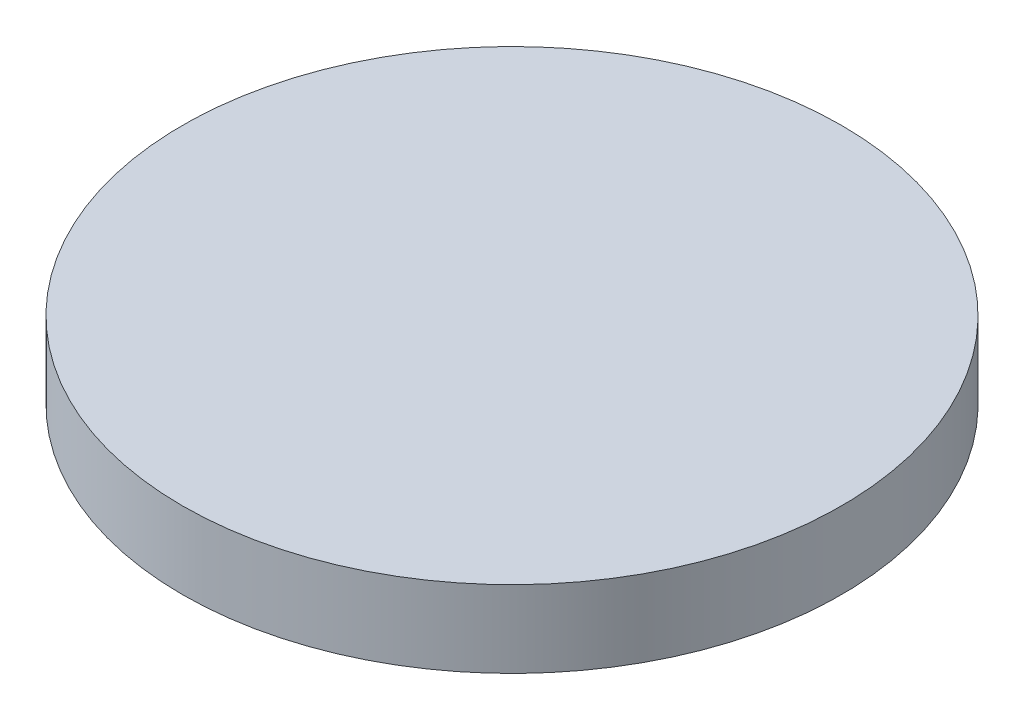
ISO-10303-21;
HEADER;
FILE_DESCRIPTION(('STEP AP214'),'2;1');
FILE_NAME('part.step','',(''),(''),'','','');
FILE_SCHEMA(('AUTOMOTIVE_DESIGN { 1 0 10303 214 1 1 1 1 }'));
ENDSEC;
DATA;
#1=APPLICATION_CONTEXT('core data for automotive mechanical design processes');
#2=APPLICATION_PROTOCOL_DEFINITION('international standard','automotive_design',2000,#1);
#3=PRODUCT_CONTEXT('',#1,'mechanical');
#4=PRODUCT('Part','Part','',(#3));
#5=PRODUCT_RELATED_PRODUCT_CATEGORY('part','',(#4));
#6=PRODUCT_DEFINITION_FORMATION('','',#4);
#7=PRODUCT_DEFINITION_CONTEXT('part definition',#1,'design');
#8=PRODUCT_DEFINITION('design','',#6,#7);
#9=PRODUCT_DEFINITION_SHAPE('','',#8);
#10=(LENGTH_UNIT() NAMED_UNIT(*) SI_UNIT(.MILLI.,.METRE.));
#11=(NAMED_UNIT(*) PLANE_ANGLE_UNIT() SI_UNIT($,.RADIAN.));
#12=(NAMED_UNIT(*) SI_UNIT($,.STERADIAN.) SOLID_ANGLE_UNIT());
#13=UNCERTAINTY_MEASURE_WITH_UNIT(LENGTH_MEASURE(1.E-05),#10,'distance_accuracy_value','');
#14=(GEOMETRIC_REPRESENTATION_CONTEXT(3) GLOBAL_UNCERTAINTY_ASSIGNED_CONTEXT((#13)) GLOBAL_UNIT_ASSIGNED_CONTEXT((#10,
#11,#12)) REPRESENTATION_CONTEXT('',''));
#15=CARTESIAN_POINT('',(0.,0.,0.));
#16=DIRECTION('',(0.,0.,1.));
#17=DIRECTION('',(1.,0.,0.));
#18=AXIS2_PLACEMENT_3D('',#15,#16,#17);
#19=CARTESIAN_POINT('',(0.,32.,0.));
#20=DIRECTION('',(0.,-1.,0.));
#21=DIRECTION('',(0.,0.,-1.));
#22=AXIS2_PLACEMENT_3D('',#19,#20,#21);
#23=CYLINDRICAL_SURFACE('',#22,60.);
#24=CARTESIAN_POINT('',(0.,32.,0.));
#25=DIRECTION('',(0.,1.,0.));
#26=DIRECTION('',(0.,0.,1.));
#27=AXIS2_PLACEMENT_3D('',#24,#25,#26);
#28=CIRCLE('',#27,60.);
#29=CARTESIAN_POINT('',(0.,32.,-60.));
#30=VERTEX_POINT('',#29);
#31=EDGE_CURVE('E10',#30,#30,#28,.T.);
#32=CARTESIAN_POINT('',(0.,18.,0.));
#33=DIRECTION('',(0.,1.,0.));
#34=DIRECTION('',(0.,0.,1.));
#35=AXIS2_PLACEMENT_3D('',#32,#33,#34);
#36=CIRCLE('',#35,60.);
#37=CARTESIAN_POINT('',(0.,18.,-60.));
#38=VERTEX_POINT('',#37);
#39=EDGE_CURVE('E40',#38,#38,#36,.T.);
#40=CARTESIAN_POINT('',(0.,32.,-60.));
#41=CARTESIAN_POINT('',(0.,31.8541666666667,-60.));
#42=CARTESIAN_POINT('',(0.,31.7083333333333,-60.));
#43=CARTESIAN_POINT('',(0.,31.4166666666667,-60.));
#44=CARTESIAN_POINT('',(0.,31.2708333333333,-60.));
#45=CARTESIAN_POINT('',(0.,30.9791666666667,-60.));
#46=CARTESIAN_POINT('',(0.,30.8333333333333,-60.));
#47=CARTESIAN_POINT('',(0.,30.5416666666667,-60.));
#48=CARTESIAN_POINT('',(0.,30.3958333333333,-60.));
#49=CARTESIAN_POINT('',(0.,30.1041666666667,-60.));
#50=CARTESIAN_POINT('',(0.,29.9583333333333,-60.));
#51=CARTESIAN_POINT('',(0.,29.6666666666667,-60.));
#52=CARTESIAN_POINT('',(0.,29.5208333333333,-60.));
#53=CARTESIAN_POINT('',(0.,29.2291666666667,-60.));
#54=CARTESIAN_POINT('',(0.,29.0833333333333,-60.));
#55=CARTESIAN_POINT('',(0.,28.7916666666667,-60.));
#56=CARTESIAN_POINT('',(0.,28.6458333333333,-60.));
#57=CARTESIAN_POINT('',(0.,28.3541666666667,-60.));
#58=CARTESIAN_POINT('',(0.,28.2083333333333,-60.));
#59=CARTESIAN_POINT('',(0.,27.9166666666667,-60.));
#60=CARTESIAN_POINT('',(0.,27.7708333333333,-60.));
#61=CARTESIAN_POINT('',(0.,27.4791666666667,-60.));
#62=CARTESIAN_POINT('',(0.,27.3333333333333,-60.));
#63=CARTESIAN_POINT('',(0.,27.0416666666667,-60.));
#64=CARTESIAN_POINT('',(0.,26.8958333333333,-60.));
#65=CARTESIAN_POINT('',(0.,26.6041666666667,-60.));
#66=CARTESIAN_POINT('',(0.,26.4583333333333,-60.));
#67=CARTESIAN_POINT('',(0.,26.1666666666667,-60.));
#68=CARTESIAN_POINT('',(0.,26.0208333333333,-60.));
#69=CARTESIAN_POINT('',(0.,25.7291666666667,-60.));
#70=CARTESIAN_POINT('',(0.,25.5833333333333,-60.));
#71=CARTESIAN_POINT('',(0.,25.2916666666667,-60.));
#72=CARTESIAN_POINT('',(0.,25.1458333333333,-60.));
#73=CARTESIAN_POINT('',(0.,24.8541666666667,-60.));
#74=CARTESIAN_POINT('',(0.,24.7083333333333,-60.));
#75=CARTESIAN_POINT('',(0.,24.4166666666667,-60.));
#76=CARTESIAN_POINT('',(0.,24.2708333333333,-60.));
#77=CARTESIAN_POINT('',(0.,23.9791666666667,-60.));
#78=CARTESIAN_POINT('',(0.,23.8333333333333,-60.));
#79=CARTESIAN_POINT('',(0.,23.5416666666667,-60.));
#80=CARTESIAN_POINT('',(0.,23.3958333333333,-60.));
#81=CARTESIAN_POINT('',(0.,23.1041666666667,-60.));
#82=CARTESIAN_POINT('',(0.,22.9583333333333,-60.));
#83=CARTESIAN_POINT('',(0.,22.6666666666667,-60.));
#84=CARTESIAN_POINT('',(0.,22.5208333333333,-60.));
#85=CARTESIAN_POINT('',(0.,22.2291666666667,-60.));
#86=CARTESIAN_POINT('',(0.,22.0833333333333,-60.));
#87=CARTESIAN_POINT('',(0.,21.7916666666667,-60.));
#88=CARTESIAN_POINT('',(0.,21.6458333333333,-60.));
#89=CARTESIAN_POINT('',(0.,21.3541666666667,-60.));
#90=CARTESIAN_POINT('',(0.,21.2083333333333,-60.));
#91=CARTESIAN_POINT('',(0.,20.9166666666667,-60.));
#92=CARTESIAN_POINT('',(0.,20.7708333333333,-60.));
#93=CARTESIAN_POINT('',(0.,20.4791666666667,-60.));
#94=CARTESIAN_POINT('',(0.,20.3333333333333,-60.));
#95=CARTESIAN_POINT('',(0.,20.0416666666667,-60.));
#96=CARTESIAN_POINT('',(0.,19.8958333333333,-60.));
#97=CARTESIAN_POINT('',(0.,19.6041666666667,-60.));
#98=CARTESIAN_POINT('',(0.,19.4583333333333,-60.));
#99=CARTESIAN_POINT('',(0.,19.1666666666667,-60.));
#100=CARTESIAN_POINT('',(0.,19.0208333333333,-60.));
#101=CARTESIAN_POINT('',(0.,18.7291666666667,-60.));
#102=CARTESIAN_POINT('',(0.,18.5833333333333,-60.));
#103=CARTESIAN_POINT('',(0.,18.2916666666667,-60.));
#104=CARTESIAN_POINT('',(0.,18.1458333333333,-60.));
#105=CARTESIAN_POINT('',(0.,18.,-60.));
#106=B_SPLINE_CURVE_WITH_KNOTS('',3,(#40,#41,#42,#43,#44,#45,#46,#47,#48,#49,#50,#51,#52,#53,
#54,#55,#56,#57,#58,#59,#60,#61,#62,#63,#64,#65,#66,#67,#68,#69,#70,#71,#72,#73,#74,#75,#76,#77,
#78,#79,#80,#81,#82,#83,#84,#85,#86,#87,#88,#89,#90,#91,#92,#93,#94,#95,#96,#97,#98,#99,#100,
#101,#102,#103,#104,#105),.UNSPECIFIED.,.F.,.F.,(4,2,2,2,2,2,2,2,2,2,2,2,2,2,2,2,2,2,2,2,2,2,2,
2,2,2,2,2,2,2,2,2,4),(0.,0.437499999999993,0.874999999999997,1.3125,1.74999999999999,2.1875,
2.625,3.0625,3.5,3.9375,4.375,4.81249999999999,5.24999999999999,5.68749999999999,
6.12499999999999,6.5625,7.,7.4375,7.87499999999999,8.31249999999999,8.74999999999999,
9.18749999999999,9.62499999999999,10.0625,10.5,10.9375,11.375,11.8125,12.25,12.6875,13.125,
13.5625,14.),.UNSPECIFIED.);
#107=EDGE_CURVE('BSEAM37',#30,#38,#106,.T.);
#108=ORIENTED_EDGE('',*,*,#31,.F.);
#109=ORIENTED_EDGE('',*,*,#39,.T.);
#110=ORIENTED_EDGE('',*,*,#107,.T.);
#111=ORIENTED_EDGE('',*,*,#107,.F.);
#112=EDGE_LOOP('',(#108,#110,#109,#111));
#113=FACE_BOUND('',#112,.T.);
#114=ADVANCED_FACE('F37',(#113),#23,.T.);
#115=CARTESIAN_POINT('',(0.,32.,0.));
#116=DIRECTION('',(0.,1.,0.));
#117=DIRECTION('',(0.,0.,1.));
#118=AXIS2_PLACEMENT_3D('',#115,#116,#117);
#119=PLANE('',#118);
#120=ORIENTED_EDGE('',*,*,#31,.T.);
#121=EDGE_LOOP('',(#120));
#122=FACE_BOUND('',#121,.T.);
#123=ADVANCED_FACE('F54',(#122),#119,.T.);
#124=CARTESIAN_POINT('',(0.,18.,0.));
#125=DIRECTION('',(0.,1.,0.));
#126=DIRECTION('',(0.,0.,1.));
#127=AXIS2_PLACEMENT_3D('',#124,#125,#126);
#128=PLANE('',#127);
#129=ORIENTED_EDGE('',*,*,#39,.F.);
#130=EDGE_LOOP('',(#129));
#131=FACE_BOUND('',#130,.T.);
#132=ADVANCED_FACE('F52',(#131),#128,.F.);
#133=CLOSED_SHELL('',(#114,#123,#132));
#134=MANIFOLD_SOLID_BREP('B2',#133);
#135=ADVANCED_BREP_SHAPE_REPRESENTATION('',(#18,#134),#14);
#136=SHAPE_DEFINITION_REPRESENTATION(#9,#135);
ENDSEC;
END-ISO-10303-21;
